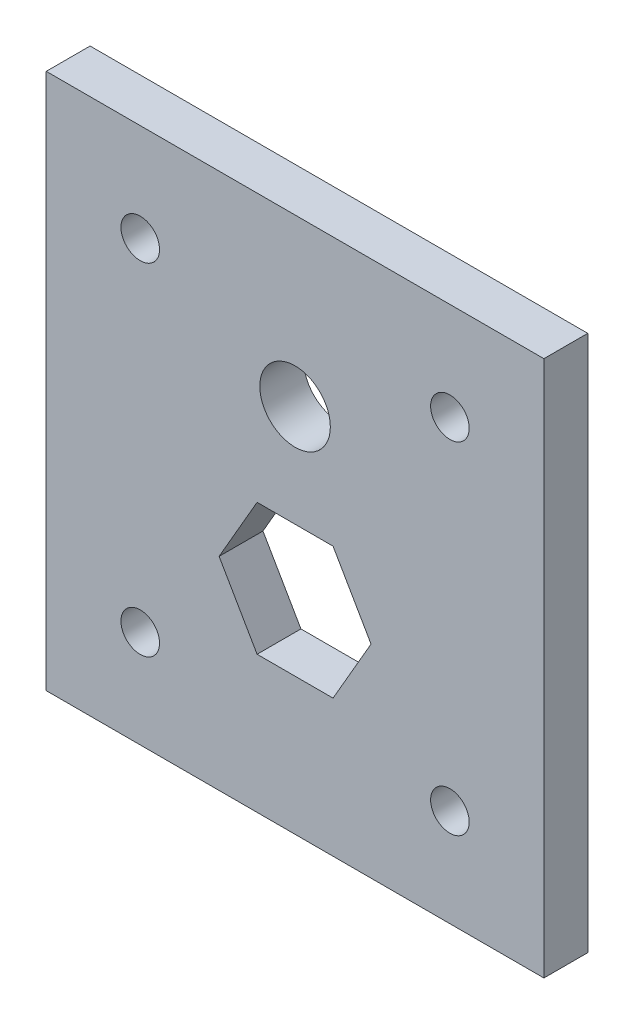
ISO-10303-21;
HEADER;
FILE_DESCRIPTION(('STEP AP214'),'2;1');
FILE_NAME('part.step','',(''),(''),'','','');
FILE_SCHEMA(('AUTOMOTIVE_DESIGN { 1 0 10303 214 1 1 1 1 }'));
ENDSEC;
DATA;
#1=APPLICATION_CONTEXT('core data for automotive mechanical design processes');
#2=APPLICATION_PROTOCOL_DEFINITION('international standard','automotive_design',2000,#1);
#3=PRODUCT_CONTEXT('',#1,'mechanical');
#4=PRODUCT('Part','Part','',(#3));
#5=PRODUCT_RELATED_PRODUCT_CATEGORY('part','',(#4));
#6=PRODUCT_DEFINITION_FORMATION('','',#4);
#7=PRODUCT_DEFINITION_CONTEXT('part definition',#1,'design');
#8=PRODUCT_DEFINITION('design','',#6,#7);
#9=PRODUCT_DEFINITION_SHAPE('','',#8);
#10=(LENGTH_UNIT() NAMED_UNIT(*) SI_UNIT(.MILLI.,.METRE.));
#11=(NAMED_UNIT(*) PLANE_ANGLE_UNIT() SI_UNIT($,.RADIAN.));
#12=(NAMED_UNIT(*) SI_UNIT($,.STERADIAN.) SOLID_ANGLE_UNIT());
#13=UNCERTAINTY_MEASURE_WITH_UNIT(LENGTH_MEASURE(1.E-05),#10,'distance_accuracy_value','');
#14=(GEOMETRIC_REPRESENTATION_CONTEXT(3) GLOBAL_UNCERTAINTY_ASSIGNED_CONTEXT((#13)) GLOBAL_UNIT_ASSIGNED_CONTEXT((#10,
#11,#12)) REPRESENTATION_CONTEXT('',''));
#15=CARTESIAN_POINT('',(0.,0.,0.));
#16=DIRECTION('',(0.,0.,1.));
#17=DIRECTION('',(1.,0.,0.));
#18=AXIS2_PLACEMENT_3D('',#15,#16,#17);
#19=CARTESIAN_POINT('',(0.,0.,3.175));
#20=DIRECTION('',(0.,0.,1.));
#21=DIRECTION('',(1.,0.,0.));
#22=AXIS2_PLACEMENT_3D('',#19,#20,#21);
#23=PLANE('',#22);
#24=CARTESIAN_POINT('',(45.9189138248361,-26.6843921091761,3.175));
#25=DIRECTION('',(0.,0.,1.));
#26=DIRECTION('',(1.,0.,0.));
#27=AXIS2_PLACEMENT_3D('',#24,#25,#26);
#28=CIRCLE('',#27,1.39700000000001);
#29=CARTESIAN_POINT('',(47.3159138248361,-26.6843921091761,3.175));
#30=VERTEX_POINT('',#29);
#31=EDGE_CURVE('E287',#30,#30,#28,.T.);
#32=ORIENTED_EDGE('',*,*,#31,.F.);
#33=EDGE_LOOP('',(#32));
#34=FACE_BOUND('',#33,.T.);
#35=CARTESIAN_POINT('',(23.5033815167566,-2.00062141277905,3.175));
#36=DIRECTION('',(0.,0.,1.));
#37=DIRECTION('',(1.,0.,0.));
#38=AXIS2_PLACEMENT_3D('',#35,#36,#37);
#39=CIRCLE('',#38,1.397);
#40=CARTESIAN_POINT('',(24.9003815167566,-2.00062141277905,3.175));
#41=VERTEX_POINT('',#40);
#42=EDGE_CURVE('E299',#41,#41,#39,.T.);
#43=ORIENTED_EDGE('',*,*,#42,.F.);
#44=EDGE_LOOP('',(#43));
#45=FACE_BOUND('',#44,.T.);
#46=DIRECTION('',(-0.499999999999999,0.866025403784439,0.));
#47=VECTOR('',#46,1.);
#48=CARTESIAN_POINT('',(40.2104089848275,-19.0791222189349,3.175));
#49=LINE('',#48,#47);
#50=CARTESIAN_POINT('',(40.2104089848275,-19.0791222189349,3.175));
#51=VERTEX_POINT('',#50);
#52=CARTESIAN_POINT('',(37.4607783278119,-14.3166222189349,3.175));
#53=VERTEX_POINT('',#52);
#54=EDGE_CURVE('E120',#51,#53,#49,.T.);
#55=ORIENTED_EDGE('',*,*,#54,.F.);
#56=DIRECTION('',(0.500000000000001,0.866025403784438,0.));
#57=VECTOR('',#56,1.);
#58=CARTESIAN_POINT('',(37.4607783278119,-23.8416222189349,3.175));
#59=LINE('',#58,#57);
#60=CARTESIAN_POINT('',(37.4607783278119,-23.8416222189349,3.175));
#61=VERTEX_POINT('',#60);
#62=EDGE_CURVE('E112',#61,#51,#59,.T.);
#63=ORIENTED_EDGE('',*,*,#62,.F.);
#64=DIRECTION('',(1.,0.,0.));
#65=VECTOR('',#64,1.);
#66=CARTESIAN_POINT('',(31.9615170137807,-23.8416222189349,3.175));
#67=LINE('',#66,#65);
#68=CARTESIAN_POINT('',(31.9615170137807,-23.8416222189349,3.175));
#69=VERTEX_POINT('',#68);
#70=EDGE_CURVE('E143',#69,#61,#67,.T.);
#71=ORIENTED_EDGE('',*,*,#70,.F.);
#72=DIRECTION('',(0.499999999999998,-0.86602540378444,0.));
#73=VECTOR('',#72,1.);
#74=CARTESIAN_POINT('',(29.2118863567651,-19.0791222189349,3.175));
#75=LINE('',#74,#73);
#76=CARTESIAN_POINT('',(29.2118863567651,-19.0791222189349,3.175));
#77=VERTEX_POINT('',#76);
#78=EDGE_CURVE('E141',#77,#69,#75,.T.);
#79=ORIENTED_EDGE('',*,*,#78,.F.);
#80=DIRECTION('',(-0.500000000000001,-0.866025403784438,0.));
#81=VECTOR('',#80,1.);
#82=CARTESIAN_POINT('',(31.9615170137807,-14.3166222189349,3.175));
#83=LINE('',#82,#81);
#84=CARTESIAN_POINT('',(31.9615170137807,-14.3166222189349,3.175));
#85=VERTEX_POINT('',#84);
#86=EDGE_CURVE('E136',#85,#77,#83,.T.);
#87=ORIENTED_EDGE('',*,*,#86,.F.);
#88=DIRECTION('',(-1.,0.,0.));
#89=VECTOR('',#88,1.);
#90=CARTESIAN_POINT('',(37.4607783278119,-14.3166222189349,3.175));
#91=LINE('',#90,#89);
#92=EDGE_CURVE('E134',#53,#85,#91,.T.);
#93=ORIENTED_EDGE('',*,*,#92,.F.);
#94=EDGE_LOOP('',(#55,#63,#71,#79,#87,#93));
#95=FACE_BOUND('',#94,.T.);
#96=DIRECTION('',(0.,-1.,0.));
#97=VECTOR('',#96,1.);
#98=CARTESIAN_POINT('',(16.6986663518038,5.07094532726984,3.175));
#99=LINE('',#98,#97);
#100=CARTESIAN_POINT('',(16.6986663518038,5.07094532726984,3.175));
#101=VERTEX_POINT('',#100);
#102=CARTESIAN_POINT('',(16.6986663518038,-33.755958849225,3.175));
#103=VERTEX_POINT('',#102);
#104=EDGE_CURVE('E166',#101,#103,#99,.T.);
#105=ORIENTED_EDGE('',*,*,#104,.T.);
#106=DIRECTION('',(1.,0.,0.));
#107=VECTOR('',#106,1.);
#108=CARTESIAN_POINT('',(16.6986663518038,-33.755958849225,3.175));
#109=LINE('',#108,#107);
#110=CARTESIAN_POINT('',(52.7236289897888,-33.755958849225,3.175));
#111=VERTEX_POINT('',#110);
#112=EDGE_CURVE('E169',#103,#111,#109,.T.);
#113=ORIENTED_EDGE('',*,*,#112,.T.);
#114=DIRECTION('',(0.,1.,0.));
#115=VECTOR('',#114,1.);
#116=CARTESIAN_POINT('',(52.7236289897888,5.07094532726984,3.175));
#117=LINE('',#116,#115);
#118=CARTESIAN_POINT('',(52.7236289897888,5.07094532726984,3.175));
#119=VERTEX_POINT('',#118);
#120=EDGE_CURVE('E172',#111,#119,#117,.T.);
#121=ORIENTED_EDGE('',*,*,#120,.T.);
#122=DIRECTION('',(-1.,0.,0.));
#123=VECTOR('',#122,1.);
#124=CARTESIAN_POINT('',(16.6986663518038,5.07094532726984,3.175));
#125=LINE('',#124,#123);
#126=EDGE_CURVE('E174',#119,#101,#125,.T.);
#127=ORIENTED_EDGE('',*,*,#126,.T.);
#128=EDGE_LOOP('',(#105,#113,#121,#127));
#129=FACE_BOUND('',#128,.T.);
#130=CARTESIAN_POINT('',(45.9189138248361,-2.00062141277905,3.175));
#131=DIRECTION('',(0.,0.,1.));
#132=DIRECTION('',(1.,0.,0.));
#133=AXIS2_PLACEMENT_3D('',#130,#131,#132);
#134=CIRCLE('',#133,1.39700000000001);
#135=CARTESIAN_POINT('',(47.3159138248361,-2.00062141277905,3.175));
#136=VERTEX_POINT('',#135);
#137=EDGE_CURVE('E146',#136,#136,#134,.T.);
#138=ORIENTED_EDGE('',*,*,#137,.F.);
#139=EDGE_LOOP('',(#138));
#140=FACE_BOUND('',#139,.T.);
#141=CARTESIAN_POINT('',(23.5033815167566,-26.6843921091761,3.175));
#142=DIRECTION('',(0.,0.,1.));
#143=DIRECTION('',(1.,0.,0.));
#144=AXIS2_PLACEMENT_3D('',#141,#142,#143);
#145=CIRCLE('',#144,1.397);
#146=CARTESIAN_POINT('',(24.9003815167566,-26.6843921091761,3.175));
#147=VERTEX_POINT('',#146);
#148=EDGE_CURVE('E293',#147,#147,#145,.T.);
#149=ORIENTED_EDGE('',*,*,#148,.F.);
#150=EDGE_LOOP('',(#149));
#151=FACE_BOUND('',#150,.T.);
#152=CARTESIAN_POINT('',(34.7111476707963,-6.93737555205847,3.175));
#153=DIRECTION('',(0.,0.,1.));
#154=DIRECTION('',(1.,0.,0.));
#155=AXIS2_PLACEMENT_3D('',#152,#153,#154);
#156=CIRCLE('',#155,2.5527);
#157=CARTESIAN_POINT('',(37.2638476707963,-6.93737555205847,3.175));
#158=VERTEX_POINT('',#157);
#159=EDGE_CURVE('E278',#158,#158,#156,.T.);
#160=ORIENTED_EDGE('',*,*,#159,.F.);
#161=EDGE_LOOP('',(#160));
#162=FACE_BOUND('',#161,.T.);
#163=ADVANCED_FACE('F35',(#34,#45,#95,#129,#140,#151,#162),#23,.T.);
#164=CARTESIAN_POINT('',(0.,0.,0.));
#165=DIRECTION('',(0.,0.,1.));
#166=DIRECTION('',(1.,0.,0.));
#167=AXIS2_PLACEMENT_3D('',#164,#165,#166);
#168=PLANE('',#167);
#169=CARTESIAN_POINT('',(45.9189138248361,-26.6843921091761,0.));
#170=DIRECTION('',(0.,0.,1.));
#171=DIRECTION('',(1.,0.,0.));
#172=AXIS2_PLACEMENT_3D('',#169,#170,#171);
#173=CIRCLE('',#172,1.39700000000001);
#174=CARTESIAN_POINT('',(47.3159138248361,-26.6843921091761,0.));
#175=VERTEX_POINT('',#174);
#176=EDGE_CURVE('E284',#175,#175,#173,.T.);
#177=ORIENTED_EDGE('',*,*,#176,.T.);
#178=EDGE_LOOP('',(#177));
#179=FACE_BOUND('',#178,.T.);
#180=CARTESIAN_POINT('',(23.5033815167566,-2.00062141277905,0.));
#181=DIRECTION('',(0.,0.,1.));
#182=DIRECTION('',(1.,0.,0.));
#183=AXIS2_PLACEMENT_3D('',#180,#181,#182);
#184=CIRCLE('',#183,1.397);
#185=CARTESIAN_POINT('',(24.9003815167566,-2.00062141277905,0.));
#186=VERTEX_POINT('',#185);
#187=EDGE_CURVE('E296',#186,#186,#184,.T.);
#188=ORIENTED_EDGE('',*,*,#187,.T.);
#189=EDGE_LOOP('',(#188));
#190=FACE_BOUND('',#189,.T.);
#191=DIRECTION('',(0.500000000000001,0.866025403784438,0.));
#192=VECTOR('',#191,1.);
#193=CARTESIAN_POINT('',(37.4607783278119,-23.8416222189349,0.));
#194=LINE('',#193,#192);
#195=CARTESIAN_POINT('',(37.4607783278119,-23.8416222189349,0.));
#196=VERTEX_POINT('',#195);
#197=CARTESIAN_POINT('',(40.2104089848275,-19.0791222189349,0.));
#198=VERTEX_POINT('',#197);
#199=EDGE_CURVE('E58',#196,#198,#194,.T.);
#200=ORIENTED_EDGE('',*,*,#199,.T.);
#201=DIRECTION('',(-0.499999999999999,0.866025403784439,0.));
#202=VECTOR('',#201,1.);
#203=CARTESIAN_POINT('',(40.2104089848275,-19.0791222189349,0.));
#204=LINE('',#203,#202);
#205=CARTESIAN_POINT('',(37.4607783278119,-14.3166222189349,0.));
#206=VERTEX_POINT('',#205);
#207=EDGE_CURVE('E127',#198,#206,#204,.T.);
#208=ORIENTED_EDGE('',*,*,#207,.T.);
#209=DIRECTION('',(-1.,0.,0.));
#210=VECTOR('',#209,1.);
#211=CARTESIAN_POINT('',(37.4607783278119,-14.3166222189349,0.));
#212=LINE('',#211,#210);
#213=CARTESIAN_POINT('',(31.9615170137807,-14.3166222189349,0.));
#214=VERTEX_POINT('',#213);
#215=EDGE_CURVE('E148',#206,#214,#212,.T.);
#216=ORIENTED_EDGE('',*,*,#215,.T.);
#217=DIRECTION('',(-0.500000000000001,-0.866025403784438,0.));
#218=VECTOR('',#217,1.);
#219=CARTESIAN_POINT('',(31.9615170137807,-14.3166222189349,0.));
#220=LINE('',#219,#218);
#221=CARTESIAN_POINT('',(29.2118863567651,-19.0791222189349,0.));
#222=VERTEX_POINT('',#221);
#223=EDGE_CURVE('E151',#214,#222,#220,.T.);
#224=ORIENTED_EDGE('',*,*,#223,.T.);
#225=DIRECTION('',(0.499999999999998,-0.86602540378444,0.));
#226=VECTOR('',#225,1.);
#227=CARTESIAN_POINT('',(29.2118863567651,-19.0791222189349,0.));
#228=LINE('',#227,#226);
#229=CARTESIAN_POINT('',(31.9615170137807,-23.8416222189349,0.));
#230=VERTEX_POINT('',#229);
#231=EDGE_CURVE('E154',#222,#230,#228,.T.);
#232=ORIENTED_EDGE('',*,*,#231,.T.);
#233=DIRECTION('',(1.,0.,0.));
#234=VECTOR('',#233,1.);
#235=CARTESIAN_POINT('',(31.9615170137807,-23.8416222189349,0.));
#236=LINE('',#235,#234);
#237=EDGE_CURVE('E121',#230,#196,#236,.T.);
#238=ORIENTED_EDGE('',*,*,#237,.T.);
#239=EDGE_LOOP('',(#200,#208,#216,#224,#232,#238));
#240=FACE_BOUND('',#239,.T.);
#241=DIRECTION('',(0.,-1.,0.));
#242=VECTOR('',#241,1.);
#243=CARTESIAN_POINT('',(16.6986663518038,5.07094532726984,0.));
#244=LINE('',#243,#242);
#245=CARTESIAN_POINT('',(16.6986663518038,5.07094532726984,0.));
#246=VERTEX_POINT('',#245);
#247=CARTESIAN_POINT('',(16.6986663518038,-33.755958849225,0.));
#248=VERTEX_POINT('',#247);
#249=EDGE_CURVE('E128',#246,#248,#244,.T.);
#250=ORIENTED_EDGE('',*,*,#249,.F.);
#251=DIRECTION('',(-1.,0.,0.));
#252=VECTOR('',#251,1.);
#253=CARTESIAN_POINT('',(16.6986663518038,5.07094532726984,0.));
#254=LINE('',#253,#252);
#255=CARTESIAN_POINT('',(52.7236289897888,5.07094532726984,0.));
#256=VERTEX_POINT('',#255);
#257=EDGE_CURVE('E170',#256,#246,#254,.T.);
#258=ORIENTED_EDGE('',*,*,#257,.F.);
#259=DIRECTION('',(0.,1.,0.));
#260=VECTOR('',#259,1.);
#261=CARTESIAN_POINT('',(52.7236289897888,5.07094532726984,0.));
#262=LINE('',#261,#260);
#263=CARTESIAN_POINT('',(52.7236289897888,-33.755958849225,0.));
#264=VERTEX_POINT('',#263);
#265=EDGE_CURVE('E181',#264,#256,#262,.T.);
#266=ORIENTED_EDGE('',*,*,#265,.F.);
#267=DIRECTION('',(1.,0.,0.));
#268=VECTOR('',#267,1.);
#269=CARTESIAN_POINT('',(16.6986663518038,-33.755958849225,0.));
#270=LINE('',#269,#268);
#271=EDGE_CURVE('E179',#248,#264,#270,.T.);
#272=ORIENTED_EDGE('',*,*,#271,.F.);
#273=EDGE_LOOP('',(#250,#258,#266,#272));
#274=FACE_BOUND('',#273,.T.);
#275=CARTESIAN_POINT('',(45.9189138248361,-2.00062141277905,0.));
#276=DIRECTION('',(0.,0.,1.));
#277=DIRECTION('',(1.,0.,0.));
#278=AXIS2_PLACEMENT_3D('',#275,#276,#277);
#279=CIRCLE('',#278,1.39700000000001);
#280=CARTESIAN_POINT('',(47.3159138248361,-2.00062141277905,0.));
#281=VERTEX_POINT('',#280);
#282=EDGE_CURVE('E302',#281,#281,#279,.T.);
#283=ORIENTED_EDGE('',*,*,#282,.T.);
#284=EDGE_LOOP('',(#283));
#285=FACE_BOUND('',#284,.T.);
#286=CARTESIAN_POINT('',(23.5033815167566,-26.6843921091761,0.));
#287=DIRECTION('',(0.,0.,1.));
#288=DIRECTION('',(1.,0.,0.));
#289=AXIS2_PLACEMENT_3D('',#286,#287,#288);
#290=CIRCLE('',#289,1.397);
#291=CARTESIAN_POINT('',(24.9003815167566,-26.6843921091761,0.));
#292=VERTEX_POINT('',#291);
#293=EDGE_CURVE('E290',#292,#292,#290,.T.);
#294=ORIENTED_EDGE('',*,*,#293,.T.);
#295=EDGE_LOOP('',(#294));
#296=FACE_BOUND('',#295,.T.);
#297=CARTESIAN_POINT('',(34.7111476707963,-6.93737555205847,0.));
#298=DIRECTION('',(0.,0.,1.));
#299=DIRECTION('',(1.,0.,0.));
#300=AXIS2_PLACEMENT_3D('',#297,#298,#299);
#301=CIRCLE('',#300,2.5527);
#302=CARTESIAN_POINT('',(37.2638476707963,-6.93737555205847,0.));
#303=VERTEX_POINT('',#302);
#304=EDGE_CURVE('E281',#303,#303,#301,.T.);
#305=ORIENTED_EDGE('',*,*,#304,.T.);
#306=EDGE_LOOP('',(#305));
#307=FACE_BOUND('',#306,.T.);
#308=ADVANCED_FACE('F199',(#179,#190,#240,#274,#285,#296,#307),#168,.F.);
#309=CARTESIAN_POINT('',(16.6986663518038,5.07094532726984,3.175));
#310=DIRECTION('',(1.,0.,0.));
#311=DIRECTION('',(0.,0.,-1.));
#312=AXIS2_PLACEMENT_3D('',#309,#310,#311);
#313=PLANE('',#312);
#314=ORIENTED_EDGE('',*,*,#249,.T.);
#315=DIRECTION('',(0.,0.,-1.));
#316=VECTOR('',#315,1.);
#317=CARTESIAN_POINT('',(16.6986663518038,-33.755958849225,3.175));
#318=LINE('',#317,#316);
#319=EDGE_CURVE('E11',#103,#248,#318,.T.);
#320=ORIENTED_EDGE('',*,*,#319,.F.);
#321=ORIENTED_EDGE('',*,*,#104,.F.);
#322=DIRECTION('',(0.,0.,-1.));
#323=VECTOR('',#322,1.);
#324=CARTESIAN_POINT('',(16.6986663518038,5.07094532726984,3.175));
#325=LINE('',#324,#323);
#326=EDGE_CURVE('E176',#101,#246,#325,.T.);
#327=ORIENTED_EDGE('',*,*,#326,.T.);
#328=EDGE_LOOP('',(#314,#320,#321,#327));
#329=FACE_BOUND('',#328,.T.);
#330=ADVANCED_FACE('F37',(#329),#313,.F.);
#331=CARTESIAN_POINT('',(16.6986663518038,-33.755958849225,3.175));
#332=DIRECTION('',(0.,1.,0.));
#333=DIRECTION('',(0.,0.,1.));
#334=AXIS2_PLACEMENT_3D('',#331,#332,#333);
#335=PLANE('',#334);
#336=ORIENTED_EDGE('',*,*,#271,.T.);
#337=DIRECTION('',(0.,0.,-1.));
#338=VECTOR('',#337,1.);
#339=CARTESIAN_POINT('',(52.7236289897888,-33.755958849225,3.175));
#340=LINE('',#339,#338);
#341=EDGE_CURVE('E43',#111,#264,#340,.T.);
#342=ORIENTED_EDGE('',*,*,#341,.F.);
#343=ORIENTED_EDGE('',*,*,#112,.F.);
#344=ORIENTED_EDGE('',*,*,#319,.T.);
#345=EDGE_LOOP('',(#336,#342,#343,#344));
#346=FACE_BOUND('',#345,.T.);
#347=ADVANCED_FACE('F209',(#346),#335,.F.);
#348=CARTESIAN_POINT('',(52.7236289897888,5.07094532726984,3.175));
#349=DIRECTION('',(-1.,0.,0.));
#350=DIRECTION('',(0.,0.,1.));
#351=AXIS2_PLACEMENT_3D('',#348,#349,#350);
#352=PLANE('',#351);
#353=ORIENTED_EDGE('',*,*,#265,.T.);
#354=DIRECTION('',(0.,0.,-1.));
#355=VECTOR('',#354,1.);
#356=CARTESIAN_POINT('',(52.7236289897888,5.07094532726984,3.175));
#357=LINE('',#356,#355);
#358=EDGE_CURVE('E186',#119,#256,#357,.T.);
#359=ORIENTED_EDGE('',*,*,#358,.F.);
#360=ORIENTED_EDGE('',*,*,#120,.F.);
#361=ORIENTED_EDGE('',*,*,#341,.T.);
#362=EDGE_LOOP('',(#353,#359,#360,#361));
#363=FACE_BOUND('',#362,.T.);
#364=ADVANCED_FACE('F193',(#363),#352,.F.);
#365=CARTESIAN_POINT('',(16.6986663518038,5.07094532726984,3.175));
#366=DIRECTION('',(0.,-1.,0.));
#367=DIRECTION('',(0.,0.,-1.));
#368=AXIS2_PLACEMENT_3D('',#365,#366,#367);
#369=PLANE('',#368);
#370=ORIENTED_EDGE('',*,*,#257,.T.);
#371=ORIENTED_EDGE('',*,*,#326,.F.);
#372=ORIENTED_EDGE('',*,*,#126,.F.);
#373=ORIENTED_EDGE('',*,*,#358,.T.);
#374=EDGE_LOOP('',(#370,#371,#372,#373));
#375=FACE_BOUND('',#374,.T.);
#376=ADVANCED_FACE('F203',(#375),#369,.F.);
#377=CARTESIAN_POINT('',(37.4607783278119,-23.8416222189349,3.175));
#378=DIRECTION('',(-0.866025403784438,0.500000000000001,0.));
#379=DIRECTION('',(-0.500000000000001,-0.866025403784438,0.));
#380=AXIS2_PLACEMENT_3D('',#377,#378,#379);
#381=PLANE('',#380);
#382=ORIENTED_EDGE('',*,*,#199,.F.);
#383=DIRECTION('',(0.,0.,-1.));
#384=VECTOR('',#383,1.);
#385=CARTESIAN_POINT('',(37.4607783278119,-23.8416222189349,3.175));
#386=LINE('',#385,#384);
#387=EDGE_CURVE('E116',#61,#196,#386,.T.);
#388=ORIENTED_EDGE('',*,*,#387,.F.);
#389=ORIENTED_EDGE('',*,*,#62,.T.);
#390=DIRECTION('',(0.,0.,-1.));
#391=VECTOR('',#390,1.);
#392=CARTESIAN_POINT('',(40.2104089848275,-19.0791222189349,3.175));
#393=LINE('',#392,#391);
#394=EDGE_CURVE('E115',#51,#198,#393,.T.);
#395=ORIENTED_EDGE('',*,*,#394,.T.);
#396=EDGE_LOOP('',(#382,#388,#389,#395));
#397=FACE_BOUND('',#396,.T.);
#398=ADVANCED_FACE('F114',(#397),#381,.T.);
#399=CARTESIAN_POINT('',(40.2104089848275,-19.0791222189349,3.175));
#400=DIRECTION('',(-0.866025403784439,-0.499999999999999,0.));
#401=DIRECTION('',(0.499999999999999,-0.866025403784439,0.));
#402=AXIS2_PLACEMENT_3D('',#399,#400,#401);
#403=PLANE('',#402);
#404=ORIENTED_EDGE('',*,*,#207,.F.);
#405=ORIENTED_EDGE('',*,*,#394,.F.);
#406=ORIENTED_EDGE('',*,*,#54,.T.);
#407=DIRECTION('',(0.,0.,-1.));
#408=VECTOR('',#407,1.);
#409=CARTESIAN_POINT('',(37.4607783278119,-14.3166222189349,3.175));
#410=LINE('',#409,#408);
#411=EDGE_CURVE('E129',#53,#206,#410,.T.);
#412=ORIENTED_EDGE('',*,*,#411,.T.);
#413=EDGE_LOOP('',(#404,#405,#406,#412));
#414=FACE_BOUND('',#413,.T.);
#415=ADVANCED_FACE('F124',(#414),#403,.T.);
#416=CARTESIAN_POINT('',(37.4607783278119,-14.3166222189349,3.175));
#417=DIRECTION('',(0.,-1.,0.));
#418=DIRECTION('',(1.,0.,0.));
#419=AXIS2_PLACEMENT_3D('',#416,#417,#418);
#420=PLANE('',#419);
#421=ORIENTED_EDGE('',*,*,#215,.F.);
#422=ORIENTED_EDGE('',*,*,#411,.F.);
#423=ORIENTED_EDGE('',*,*,#92,.T.);
#424=DIRECTION('',(0.,0.,-1.));
#425=VECTOR('',#424,1.);
#426=CARTESIAN_POINT('',(31.9615170137807,-14.3166222189349,3.175));
#427=LINE('',#426,#425);
#428=EDGE_CURVE('E163',#85,#214,#427,.T.);
#429=ORIENTED_EDGE('',*,*,#428,.T.);
#430=EDGE_LOOP('',(#421,#422,#423,#429));
#431=FACE_BOUND('',#430,.T.);
#432=ADVANCED_FACE('F236',(#431),#420,.T.);
#433=CARTESIAN_POINT('',(31.9615170137807,-14.3166222189349,3.175));
#434=DIRECTION('',(0.866025403784438,-0.500000000000001,0.));
#435=DIRECTION('',(0.500000000000002,0.866025403784438,0.));
#436=AXIS2_PLACEMENT_3D('',#433,#434,#435);
#437=PLANE('',#436);
#438=ORIENTED_EDGE('',*,*,#223,.F.);
#439=ORIENTED_EDGE('',*,*,#428,.F.);
#440=ORIENTED_EDGE('',*,*,#86,.T.);
#441=DIRECTION('',(0.,0.,-1.));
#442=VECTOR('',#441,1.);
#443=CARTESIAN_POINT('',(29.2118863567651,-19.0791222189349,3.175));
#444=LINE('',#443,#442);
#445=EDGE_CURVE('E161',#77,#222,#444,.T.);
#446=ORIENTED_EDGE('',*,*,#445,.T.);
#447=EDGE_LOOP('',(#438,#439,#440,#446));
#448=FACE_BOUND('',#447,.T.);
#449=ADVANCED_FACE('F240',(#448),#437,.T.);
#450=CARTESIAN_POINT('',(29.2118863567651,-19.0791222189349,3.175));
#451=DIRECTION('',(0.86602540378444,0.499999999999998,0.));
#452=DIRECTION('',(-0.499999999999998,0.86602540378444,0.));
#453=AXIS2_PLACEMENT_3D('',#450,#451,#452);
#454=PLANE('',#453);
#455=ORIENTED_EDGE('',*,*,#231,.F.);
#456=ORIENTED_EDGE('',*,*,#445,.F.);
#457=ORIENTED_EDGE('',*,*,#78,.T.);
#458=DIRECTION('',(0.,0.,-1.));
#459=VECTOR('',#458,1.);
#460=CARTESIAN_POINT('',(31.9615170137807,-23.8416222189349,3.175));
#461=LINE('',#460,#459);
#462=EDGE_CURVE('E50',#69,#230,#461,.T.);
#463=ORIENTED_EDGE('',*,*,#462,.T.);
#464=EDGE_LOOP('',(#455,#456,#457,#463));
#465=FACE_BOUND('',#464,.T.);
#466=ADVANCED_FACE('F246',(#465),#454,.T.);
#467=CARTESIAN_POINT('',(31.9615170137807,-23.8416222189349,3.175));
#468=DIRECTION('',(0.,1.,0.));
#469=DIRECTION('',(0.,0.,1.));
#470=AXIS2_PLACEMENT_3D('',#467,#468,#469);
#471=PLANE('',#470);
#472=ORIENTED_EDGE('',*,*,#237,.F.);
#473=ORIENTED_EDGE('',*,*,#462,.F.);
#474=ORIENTED_EDGE('',*,*,#70,.T.);
#475=ORIENTED_EDGE('',*,*,#387,.T.);
#476=EDGE_LOOP('',(#472,#473,#474,#475));
#477=FACE_BOUND('',#476,.T.);
#478=ADVANCED_FACE('F250',(#477),#471,.T.);
#479=CARTESIAN_POINT('',(45.9189138248361,-2.00062141277905,3.175));
#480=DIRECTION('',(0.,0.,-1.));
#481=DIRECTION('',(-1.,0.,0.));
#482=AXIS2_PLACEMENT_3D('',#479,#480,#481);
#483=CYLINDRICAL_SURFACE('',#482,1.39700000000001);
#484=ORIENTED_EDGE('',*,*,#137,.T.);
#485=EDGE_LOOP('',(#484));
#486=FACE_BOUND('',#485,.T.);
#487=ORIENTED_EDGE('',*,*,#282,.F.);
#488=EDGE_LOOP('',(#487));
#489=FACE_BOUND('',#488,.T.);
#490=ADVANCED_FACE('F254',(#486,#489),#483,.F.);
#491=CARTESIAN_POINT('',(23.5033815167566,-2.00062141277905,3.175));
#492=DIRECTION('',(0.,0.,-1.));
#493=DIRECTION('',(-1.,0.,0.));
#494=AXIS2_PLACEMENT_3D('',#491,#492,#493);
#495=CYLINDRICAL_SURFACE('',#494,1.397);
#496=ORIENTED_EDGE('',*,*,#42,.T.);
#497=EDGE_LOOP('',(#496));
#498=FACE_BOUND('',#497,.T.);
#499=ORIENTED_EDGE('',*,*,#187,.F.);
#500=EDGE_LOOP('',(#499));
#501=FACE_BOUND('',#500,.T.);
#502=ADVANCED_FACE('F257',(#498,#501),#495,.F.);
#503=CARTESIAN_POINT('',(23.5033815167566,-26.6843921091761,3.175));
#504=DIRECTION('',(0.,0.,-1.));
#505=DIRECTION('',(-1.,0.,0.));
#506=AXIS2_PLACEMENT_3D('',#503,#504,#505);
#507=CYLINDRICAL_SURFACE('',#506,1.397);
#508=ORIENTED_EDGE('',*,*,#148,.T.);
#509=EDGE_LOOP('',(#508));
#510=FACE_BOUND('',#509,.T.);
#511=ORIENTED_EDGE('',*,*,#293,.F.);
#512=EDGE_LOOP('',(#511));
#513=FACE_BOUND('',#512,.T.);
#514=ADVANCED_FACE('F261',(#510,#513),#507,.F.);
#515=CARTESIAN_POINT('',(45.9189138248361,-26.6843921091761,3.175));
#516=DIRECTION('',(0.,0.,-1.));
#517=DIRECTION('',(-1.,0.,0.));
#518=AXIS2_PLACEMENT_3D('',#515,#516,#517);
#519=CYLINDRICAL_SURFACE('',#518,1.39700000000001);
#520=ORIENTED_EDGE('',*,*,#31,.T.);
#521=EDGE_LOOP('',(#520));
#522=FACE_BOUND('',#521,.T.);
#523=ORIENTED_EDGE('',*,*,#176,.F.);
#524=EDGE_LOOP('',(#523));
#525=FACE_BOUND('',#524,.T.);
#526=ADVANCED_FACE('F265',(#522,#525),#519,.F.);
#527=CARTESIAN_POINT('',(34.7111476707963,-6.93737555205847,3.175));
#528=DIRECTION('',(0.,0.,-1.));
#529=DIRECTION('',(-1.,0.,0.));
#530=AXIS2_PLACEMENT_3D('',#527,#528,#529);
#531=CYLINDRICAL_SURFACE('',#530,2.5527);
#532=ORIENTED_EDGE('',*,*,#159,.T.);
#533=EDGE_LOOP('',(#532));
#534=FACE_BOUND('',#533,.T.);
#535=ORIENTED_EDGE('',*,*,#304,.F.);
#536=EDGE_LOOP('',(#535));
#537=FACE_BOUND('',#536,.T.);
#538=ADVANCED_FACE('F269',(#534,#537),#531,.F.);
#539=CLOSED_SHELL('',(#163,#308,#330,#347,#364,#376,#398,#415,#432,#449,#466,#478,#490,#502,
#514,#526,#538));
#540=MANIFOLD_SOLID_BREP('B2',#539);
#541=ADVANCED_BREP_SHAPE_REPRESENTATION('',(#18,#540),#14);
#542=SHAPE_DEFINITION_REPRESENTATION(#9,#541);
ENDSEC;
END-ISO-10303-21;
